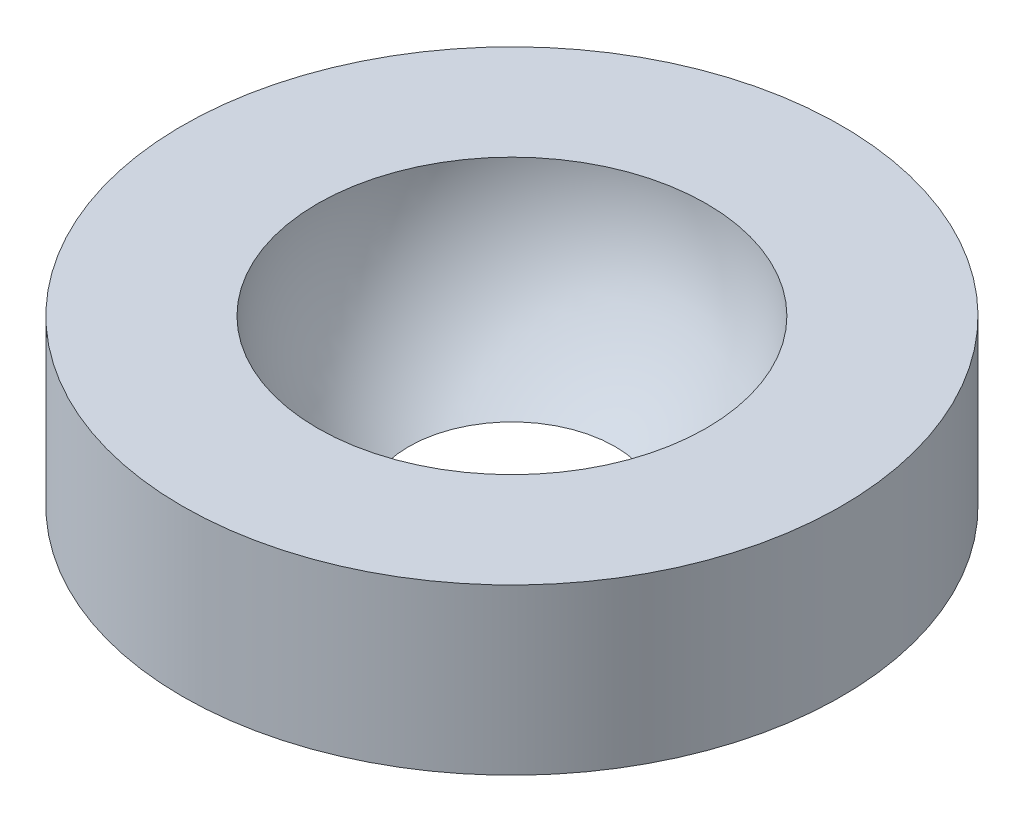
ISO-10303-21;
HEADER;
FILE_DESCRIPTION(('STEP AP214'),'2;1');
FILE_NAME('part.step','',(''),(''),'','','');
FILE_SCHEMA(('AUTOMOTIVE_DESIGN { 1 0 10303 214 1 1 1 1 }'));
ENDSEC;
DATA;
#1=APPLICATION_CONTEXT('core data for automotive mechanical design processes');
#2=APPLICATION_PROTOCOL_DEFINITION('international standard','automotive_design',2000,#1);
#3=PRODUCT_CONTEXT('',#1,'mechanical');
#4=PRODUCT('Part','Part','',(#3));
#5=PRODUCT_RELATED_PRODUCT_CATEGORY('part','',(#4));
#6=PRODUCT_DEFINITION_FORMATION('','',#4);
#7=PRODUCT_DEFINITION_CONTEXT('part definition',#1,'design');
#8=PRODUCT_DEFINITION('design','',#6,#7);
#9=PRODUCT_DEFINITION_SHAPE('','',#8);
#10=(LENGTH_UNIT() NAMED_UNIT(*) SI_UNIT(.MILLI.,.METRE.));
#11=(NAMED_UNIT(*) PLANE_ANGLE_UNIT() SI_UNIT($,.RADIAN.));
#12=(NAMED_UNIT(*) SI_UNIT($,.STERADIAN.) SOLID_ANGLE_UNIT());
#13=UNCERTAINTY_MEASURE_WITH_UNIT(LENGTH_MEASURE(1.E-05),#10,'distance_accuracy_value','');
#14=(GEOMETRIC_REPRESENTATION_CONTEXT(3) GLOBAL_UNCERTAINTY_ASSIGNED_CONTEXT((#13)) GLOBAL_UNIT_ASSIGNED_CONTEXT((#10,
#11,#12)) REPRESENTATION_CONTEXT('',''));
#15=CARTESIAN_POINT('',(0.,0.,0.));
#16=DIRECTION('',(0.,0.,1.));
#17=DIRECTION('',(1.,0.,0.));
#18=AXIS2_PLACEMENT_3D('',#15,#16,#17);
#19=CARTESIAN_POINT('',(0.,0.,0.));
#20=DIRECTION('',(0.,1.,0.));
#21=DIRECTION('',(1.,0.,0.));
#22=AXIS2_PLACEMENT_3D('',#19,#20,#21);
#23=SPHERICAL_SURFACE('',#22,7.493);
#24=CARTESIAN_POINT('',(0.,0.,0.));
#25=DIRECTION('',(0.,1.,0.));
#26=DIRECTION('',(0.,0.,1.));
#27=AXIS2_PLACEMENT_3D('',#24,#25,#26);
#28=CIRCLE('',#27,7.493);
#29=CARTESIAN_POINT('',(0.,0.,7.493));
#30=VERTEX_POINT('',#29);
#31=EDGE_CURVE('E45',#30,#30,#28,.T.);
#32=ORIENTED_EDGE('',*,*,#31,.T.);
#33=EDGE_LOOP('',(#32));
#34=FACE_BOUND('',#33,.T.);
#35=CARTESIAN_POINT('',(0.,-6.35,0.));
#36=DIRECTION('',(0.,1.,0.));
#37=DIRECTION('',(0.,0.,1.));
#38=AXIS2_PLACEMENT_3D('',#35,#36,#37);
#39=CIRCLE('',#38,3.97775677989492);
#40=CARTESIAN_POINT('',(0.,-6.35,3.97775677989492));
#41=VERTEX_POINT('',#40);
#42=EDGE_CURVE('E10',#41,#41,#39,.T.);
#43=ORIENTED_EDGE('',*,*,#42,.F.);
#44=EDGE_LOOP('',(#43));
#45=FACE_BOUND('',#44,.T.);
#46=ADVANCED_FACE('F31',(#34,#45),#23,.F.);
#47=CARTESIAN_POINT('',(0.,-6.35,0.));
#48=DIRECTION('',(0.,-1.,0.));
#49=DIRECTION('',(0.,0.,-1.));
#50=AXIS2_PLACEMENT_3D('',#47,#48,#49);
#51=PLANE('',#50);
#52=ORIENTED_EDGE('',*,*,#42,.T.);
#53=EDGE_LOOP('',(#52));
#54=FACE_BOUND('',#53,.T.);
#55=CARTESIAN_POINT('',(0.,-6.35,0.));
#56=DIRECTION('',(0.,1.,0.));
#57=DIRECTION('',(0.,0.,1.));
#58=AXIS2_PLACEMENT_3D('',#55,#56,#57);
#59=CIRCLE('',#58,12.7);
#60=CARTESIAN_POINT('',(0.,-6.35,12.7));
#61=VERTEX_POINT('',#60);
#62=EDGE_CURVE('E37',#61,#61,#59,.T.);
#63=ORIENTED_EDGE('',*,*,#62,.F.);
#64=EDGE_LOOP('',(#63));
#65=FACE_BOUND('',#64,.T.);
#66=ADVANCED_FACE('F61',(#54,#65),#51,.T.);
#67=CARTESIAN_POINT('',(0.,12.1169385781049,0.));
#68=DIRECTION('',(0.,1.,0.));
#69=DIRECTION('',(0.,0.,1.));
#70=AXIS2_PLACEMENT_3D('',#67,#68,#69);
#71=CYLINDRICAL_SURFACE('',#70,12.7);
#72=ORIENTED_EDGE('',*,*,#62,.T.);
#73=EDGE_LOOP('',(#72));
#74=FACE_BOUND('',#73,.T.);
#75=CARTESIAN_POINT('',(0.,0.,0.));
#76=DIRECTION('',(0.,1.,0.));
#77=DIRECTION('',(0.,0.,1.));
#78=AXIS2_PLACEMENT_3D('',#75,#76,#77);
#79=CIRCLE('',#78,12.7);
#80=CARTESIAN_POINT('',(0.,0.,12.7));
#81=VERTEX_POINT('',#80);
#82=EDGE_CURVE('E41',#81,#81,#79,.T.);
#83=ORIENTED_EDGE('',*,*,#82,.F.);
#84=EDGE_LOOP('',(#83));
#85=FACE_BOUND('',#84,.T.);
#86=ADVANCED_FACE('F56',(#74,#85),#71,.T.);
#87=CARTESIAN_POINT('',(0.,0.,0.));
#88=DIRECTION('',(0.,-1.,0.));
#89=DIRECTION('',(0.,0.,-1.));
#90=AXIS2_PLACEMENT_3D('',#87,#88,#89);
#91=PLANE('',#90);
#92=ORIENTED_EDGE('',*,*,#31,.F.);
#93=EDGE_LOOP('',(#92));
#94=FACE_BOUND('',#93,.T.);
#95=ORIENTED_EDGE('',*,*,#82,.T.);
#96=EDGE_LOOP('',(#95));
#97=FACE_BOUND('',#96,.T.);
#98=ADVANCED_FACE('F53',(#94,#97),#91,.F.);
#99=CLOSED_SHELL('',(#46,#66,#86,#98));
#100=MANIFOLD_SOLID_BREP('B2',#99);
#101=ADVANCED_BREP_SHAPE_REPRESENTATION('',(#18,#100),#14);
#102=SHAPE_DEFINITION_REPRESENTATION(#9,#101);
ENDSEC;
END-ISO-10303-21;
